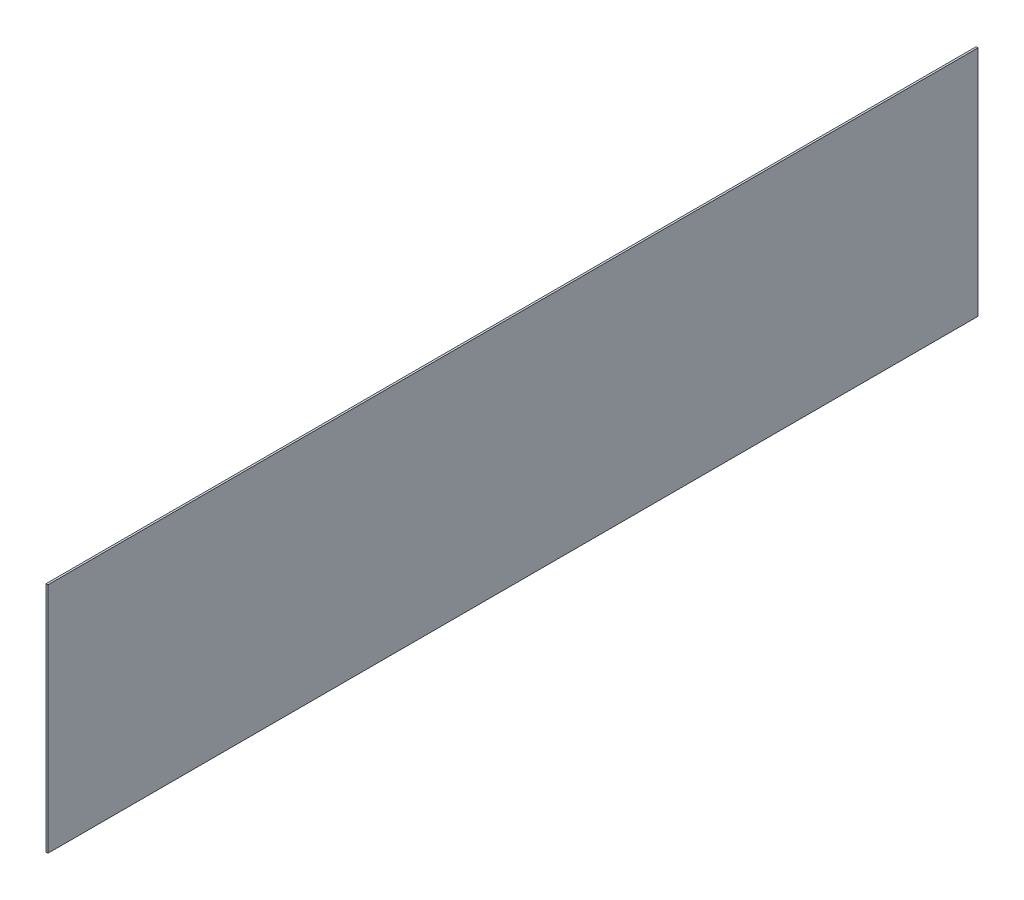
ISO-10303-21;
HEADER;
FILE_DESCRIPTION(('STEP AP214'),'2;1');
FILE_NAME('part.step','',(''),(''),'','','');
FILE_SCHEMA(('AUTOMOTIVE_DESIGN { 1 0 10303 214 1 1 1 1 }'));
ENDSEC;
DATA;
#1=APPLICATION_CONTEXT('core data for automotive mechanical design processes');
#2=APPLICATION_PROTOCOL_DEFINITION('international standard','automotive_design',2000,#1);
#3=PRODUCT_CONTEXT('',#1,'mechanical');
#4=PRODUCT('Part','Part','',(#3));
#5=PRODUCT_RELATED_PRODUCT_CATEGORY('part','',(#4));
#6=PRODUCT_DEFINITION_FORMATION('','',#4);
#7=PRODUCT_DEFINITION_CONTEXT('part definition',#1,'design');
#8=PRODUCT_DEFINITION('design','',#6,#7);
#9=PRODUCT_DEFINITION_SHAPE('','',#8);
#10=(LENGTH_UNIT() NAMED_UNIT(*) SI_UNIT(.MILLI.,.METRE.));
#11=(NAMED_UNIT(*) PLANE_ANGLE_UNIT() SI_UNIT($,.RADIAN.));
#12=(NAMED_UNIT(*) SI_UNIT($,.STERADIAN.) SOLID_ANGLE_UNIT());
#13=UNCERTAINTY_MEASURE_WITH_UNIT(LENGTH_MEASURE(1.E-05),#10,'distance_accuracy_value','');
#14=(GEOMETRIC_REPRESENTATION_CONTEXT(3) GLOBAL_UNCERTAINTY_ASSIGNED_CONTEXT((#13)) GLOBAL_UNIT_ASSIGNED_CONTEXT((#10,
#11,#12)) REPRESENTATION_CONTEXT('',''));
#15=CARTESIAN_POINT('',(0.,0.,0.));
#16=DIRECTION('',(0.,0.,1.));
#17=DIRECTION('',(1.,0.,0.));
#18=AXIS2_PLACEMENT_3D('',#15,#16,#17);
#19=CARTESIAN_POINT('',(0.3175,76.1999999999999,152.4));
#20=DIRECTION('',(0.,0.,-1.));
#21=DIRECTION('',(-1.,0.,0.));
#22=AXIS2_PLACEMENT_3D('',#19,#20,#21);
#23=PLANE('',#22);
#24=DIRECTION('',(0.,-1.,0.));
#25=VECTOR('',#24,1.);
#26=CARTESIAN_POINT('',(-0.3175,76.1999999999999,152.4));
#27=LINE('',#26,#25);
#28=CARTESIAN_POINT('',(-0.3175,76.1999999999999,152.4));
#29=VERTEX_POINT('',#28);
#30=CARTESIAN_POINT('',(-0.3175,0.,152.4));
#31=VERTEX_POINT('',#30);
#32=EDGE_CURVE('E98',#29,#31,#27,.T.);
#33=ORIENTED_EDGE('',*,*,#32,.T.);
#34=DIRECTION('',(-1.,0.,0.));
#35=VECTOR('',#34,1.);
#36=CARTESIAN_POINT('',(0.3175,0.,152.4));
#37=LINE('',#36,#35);
#38=CARTESIAN_POINT('',(0.3175,0.,152.4));
#39=VERTEX_POINT('',#38);
#40=EDGE_CURVE('E11',#39,#31,#37,.T.);
#41=ORIENTED_EDGE('',*,*,#40,.F.);
#42=DIRECTION('',(0.,-1.,0.));
#43=VECTOR('',#42,1.);
#44=CARTESIAN_POINT('',(0.3175,76.1999999999999,152.4));
#45=LINE('',#44,#43);
#46=CARTESIAN_POINT('',(0.3175,76.1999999999999,152.4));
#47=VERTEX_POINT('',#46);
#48=EDGE_CURVE('E86',#47,#39,#45,.T.);
#49=ORIENTED_EDGE('',*,*,#48,.F.);
#50=DIRECTION('',(-1.,0.,0.));
#51=VECTOR('',#50,1.);
#52=CARTESIAN_POINT('',(0.3175,76.1999999999999,152.4));
#53=LINE('',#52,#51);
#54=EDGE_CURVE('E94',#47,#29,#53,.T.);
#55=ORIENTED_EDGE('',*,*,#54,.T.);
#56=EDGE_LOOP('',(#33,#41,#49,#55));
#57=FACE_BOUND('',#56,.T.);
#58=ADVANCED_FACE('F35',(#57),#23,.F.);
#59=CARTESIAN_POINT('',(0.3175,0.,152.4));
#60=DIRECTION('',(0.,1.,0.));
#61=DIRECTION('',(0.,0.,1.));
#62=AXIS2_PLACEMENT_3D('',#59,#60,#61);
#63=PLANE('',#62);
#64=DIRECTION('',(0.,0.,-1.));
#65=VECTOR('',#64,1.);
#66=CARTESIAN_POINT('',(-0.3175,0.,152.4));
#67=LINE('',#66,#65);
#68=CARTESIAN_POINT('',(-0.3175,0.,-152.4));
#69=VERTEX_POINT('',#68);
#70=EDGE_CURVE('E90',#31,#69,#67,.T.);
#71=ORIENTED_EDGE('',*,*,#70,.T.);
#72=DIRECTION('',(-1.,0.,0.));
#73=VECTOR('',#72,1.);
#74=CARTESIAN_POINT('',(0.3175,0.,-152.4));
#75=LINE('',#74,#73);
#76=CARTESIAN_POINT('',(0.3175,0.,-152.4));
#77=VERTEX_POINT('',#76);
#78=EDGE_CURVE('E43',#77,#69,#75,.T.);
#79=ORIENTED_EDGE('',*,*,#78,.F.);
#80=DIRECTION('',(0.,0.,-1.));
#81=VECTOR('',#80,1.);
#82=CARTESIAN_POINT('',(0.3175,0.,152.4));
#83=LINE('',#82,#81);
#84=EDGE_CURVE('E81',#39,#77,#83,.T.);
#85=ORIENTED_EDGE('',*,*,#84,.F.);
#86=ORIENTED_EDGE('',*,*,#40,.T.);
#87=EDGE_LOOP('',(#71,#79,#85,#86));
#88=FACE_BOUND('',#87,.T.);
#89=ADVANCED_FACE('F89',(#88),#63,.F.);
#90=CARTESIAN_POINT('',(0.3175,76.2,-152.4));
#91=DIRECTION('',(0.,0.,1.));
#92=DIRECTION('',(1.,0.,0.));
#93=AXIS2_PLACEMENT_3D('',#90,#91,#92);
#94=PLANE('',#93);
#95=DIRECTION('',(0.,1.,0.));
#96=VECTOR('',#95,1.);
#97=CARTESIAN_POINT('',(-0.3175,76.2,-152.4));
#98=LINE('',#97,#96);
#99=CARTESIAN_POINT('',(-0.3175,76.2,-152.4));
#100=VERTEX_POINT('',#99);
#101=EDGE_CURVE('E68',#69,#100,#98,.T.);
#102=ORIENTED_EDGE('',*,*,#101,.T.);
#103=DIRECTION('',(-1.,0.,0.));
#104=VECTOR('',#103,1.);
#105=CARTESIAN_POINT('',(0.3175,76.2,-152.4));
#106=LINE('',#105,#104);
#107=CARTESIAN_POINT('',(0.3175,76.2,-152.4));
#108=VERTEX_POINT('',#107);
#109=EDGE_CURVE('E91',#108,#100,#106,.T.);
#110=ORIENTED_EDGE('',*,*,#109,.F.);
#111=DIRECTION('',(0.,1.,0.));
#112=VECTOR('',#111,1.);
#113=CARTESIAN_POINT('',(0.3175,76.2,-152.4));
#114=LINE('',#113,#112);
#115=EDGE_CURVE('E84',#77,#108,#114,.T.);
#116=ORIENTED_EDGE('',*,*,#115,.F.);
#117=ORIENTED_EDGE('',*,*,#78,.T.);
#118=EDGE_LOOP('',(#102,#110,#116,#117));
#119=FACE_BOUND('',#118,.T.);
#120=ADVANCED_FACE('F92',(#119),#94,.F.);
#121=CARTESIAN_POINT('',(0.3175,76.1999999999999,152.4));
#122=DIRECTION('',(0.,-1.,0.));
#123=DIRECTION('',(0.,0.,-1.));
#124=AXIS2_PLACEMENT_3D('',#121,#122,#123);
#125=PLANE('',#124);
#126=DIRECTION('',(0.,0.,1.));
#127=VECTOR('',#126,1.);
#128=CARTESIAN_POINT('',(-0.3175,76.1999999999999,152.4));
#129=LINE('',#128,#127);
#130=EDGE_CURVE('E74',#100,#29,#129,.T.);
#131=ORIENTED_EDGE('',*,*,#130,.T.);
#132=ORIENTED_EDGE('',*,*,#54,.F.);
#133=DIRECTION('',(0.,0.,1.));
#134=VECTOR('',#133,1.);
#135=CARTESIAN_POINT('',(0.3175,76.1999999999999,152.4));
#136=LINE('',#135,#134);
#137=EDGE_CURVE('E51',#108,#47,#136,.T.);
#138=ORIENTED_EDGE('',*,*,#137,.F.);
#139=ORIENTED_EDGE('',*,*,#109,.T.);
#140=EDGE_LOOP('',(#131,#132,#138,#139));
#141=FACE_BOUND('',#140,.T.);
#142=ADVANCED_FACE('F105',(#141),#125,.F.);
#143=CARTESIAN_POINT('',(0.3175,0.,0.));
#144=DIRECTION('',(1.,0.,0.));
#145=DIRECTION('',(0.,0.,-1.));
#146=AXIS2_PLACEMENT_3D('',#143,#144,#145);
#147=PLANE('',#146);
#148=ORIENTED_EDGE('',*,*,#48,.T.);
#149=ORIENTED_EDGE('',*,*,#84,.T.);
#150=ORIENTED_EDGE('',*,*,#115,.T.);
#151=ORIENTED_EDGE('',*,*,#137,.T.);
#152=EDGE_LOOP('',(#148,#149,#150,#151));
#153=FACE_BOUND('',#152,.T.);
#154=ADVANCED_FACE('F82',(#153),#147,.T.);
#155=CARTESIAN_POINT('',(-0.3175,0.,0.));
#156=DIRECTION('',(1.,0.,0.));
#157=DIRECTION('',(0.,0.,-1.));
#158=AXIS2_PLACEMENT_3D('',#155,#156,#157);
#159=PLANE('',#158);
#160=ORIENTED_EDGE('',*,*,#32,.F.);
#161=ORIENTED_EDGE('',*,*,#130,.F.);
#162=ORIENTED_EDGE('',*,*,#101,.F.);
#163=ORIENTED_EDGE('',*,*,#70,.F.);
#164=EDGE_LOOP('',(#160,#161,#162,#163));
#165=FACE_BOUND('',#164,.T.);
#166=ADVANCED_FACE('F108',(#165),#159,.F.);
#167=CLOSED_SHELL('',(#58,#89,#120,#142,#154,#166));
#168=MANIFOLD_SOLID_BREP('B2',#167);
#169=ADVANCED_BREP_SHAPE_REPRESENTATION('',(#18,#168),#14);
#170=SHAPE_DEFINITION_REPRESENTATION(#9,#169);
ENDSEC;
END-ISO-10303-21;
